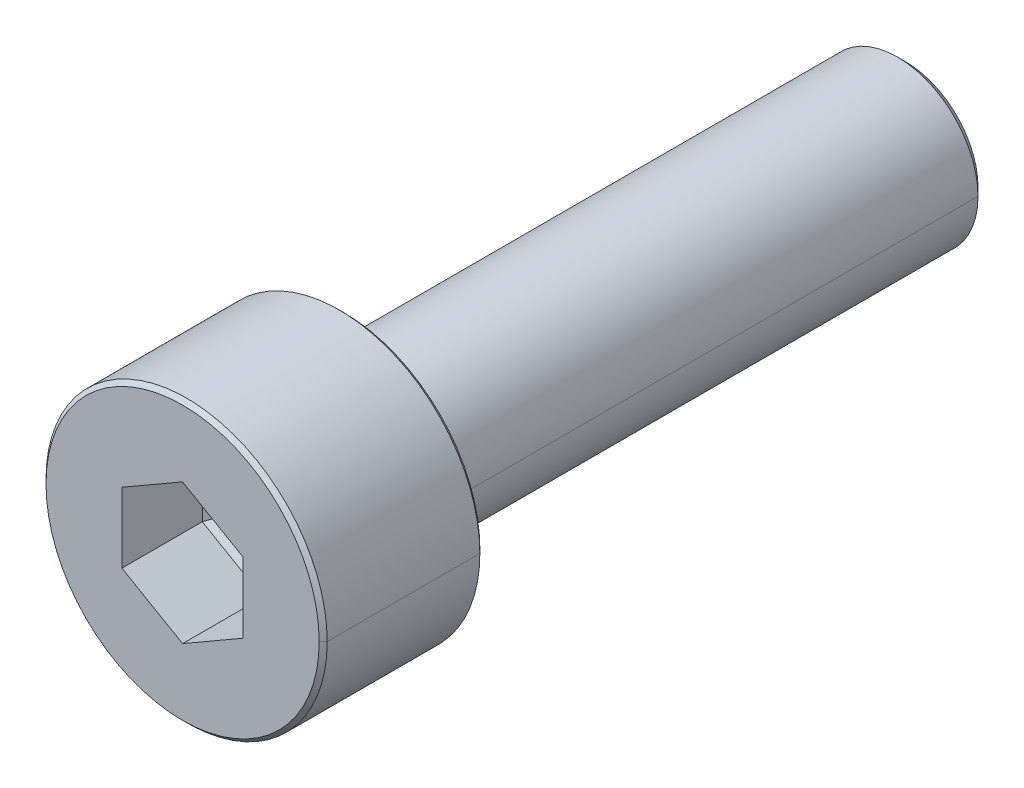
ISO-10303-21;
HEADER;
FILE_DESCRIPTION(('STEP AP214'),'2;1');
FILE_NAME('part.step','',(''),(''),'','','');
FILE_SCHEMA(('AUTOMOTIVE_DESIGN { 1 0 10303 214 1 1 1 1 }'));
ENDSEC;
DATA;
#1=APPLICATION_CONTEXT('core data for automotive mechanical design processes');
#2=APPLICATION_PROTOCOL_DEFINITION('international standard','automotive_design',2000,#1);
#3=PRODUCT_CONTEXT('',#1,'mechanical');
#4=PRODUCT('Part','Part','',(#3));
#5=PRODUCT_RELATED_PRODUCT_CATEGORY('part','',(#4));
#6=PRODUCT_DEFINITION_FORMATION('','',#4);
#7=PRODUCT_DEFINITION_CONTEXT('part definition',#1,'design');
#8=PRODUCT_DEFINITION('design','',#6,#7);
#9=PRODUCT_DEFINITION_SHAPE('','',#8);
#10=(LENGTH_UNIT() NAMED_UNIT(*) SI_UNIT(.MILLI.,.METRE.));
#11=(NAMED_UNIT(*) PLANE_ANGLE_UNIT() SI_UNIT($,.RADIAN.));
#12=(NAMED_UNIT(*) SI_UNIT($,.STERADIAN.) SOLID_ANGLE_UNIT());
#13=UNCERTAINTY_MEASURE_WITH_UNIT(LENGTH_MEASURE(1.E-05),#10,'distance_accuracy_value','');
#14=(GEOMETRIC_REPRESENTATION_CONTEXT(3) GLOBAL_UNCERTAINTY_ASSIGNED_CONTEXT((#13)) GLOBAL_UNIT_ASSIGNED_CONTEXT((#10,
#11,#12)) REPRESENTATION_CONTEXT('',''));
#15=CARTESIAN_POINT('',(0.,0.,0.));
#16=DIRECTION('',(0.,0.,1.));
#17=DIRECTION('',(1.,0.,0.));
#18=AXIS2_PLACEMENT_3D('',#15,#16,#17);
#19=CARTESIAN_POINT('',(0.,0.,14.));
#20=DIRECTION('',(0.,0.,1.));
#21=DIRECTION('',(1.,0.,0.));
#22=AXIS2_PLACEMENT_3D('',#19,#20,#21);
#23=CYLINDRICAL_SURFACE('',#22,3.5);
#24=DIRECTION('',(0.,0.,1.));
#25=VECTOR('',#24,1.);
#26=CARTESIAN_POINT('',(3.500000392578,9.868314090465E-10,14.09999960728));
#27=LINE('',#26,#25);
#28=CARTESIAN_POINT('',(3.5,0.,14.1000010898));
#29=VERTEX_POINT('',#28);
#30=CARTESIAN_POINT('',(3.5,0.,17.8999989102));
#31=VERTEX_POINT('',#30);
#32=EDGE_CURVE('E242',#29,#31,#27,.T.);
#33=ORIENTED_EDGE('',*,*,#32,.F.);
#34=CARTESIAN_POINT('',(0.,0.,14.1000010898));
#35=DIRECTION('',(0.,0.,-1.));
#36=DIRECTION('',(-1.,0.,0.));
#37=AXIS2_PLACEMENT_3D('',#34,#35,#36);
#38=CIRCLE('',#37,3.5);
#39=CARTESIAN_POINT('',(-3.5,0.,14.1000010898));
#40=VERTEX_POINT('',#39);
#41=EDGE_CURVE('E326',#40,#29,#38,.T.);
#42=ORIENTED_EDGE('',*,*,#41,.F.);
#43=DIRECTION('',(0.,0.,1.));
#44=VECTOR('',#43,1.);
#45=CARTESIAN_POINT('',(-3.500000392578,-9.868312386459E-10,14.09999960728));
#46=LINE('',#45,#44);
#47=CARTESIAN_POINT('',(-3.5,0.,17.8999989102));
#48=VERTEX_POINT('',#47);
#49=EDGE_CURVE('E196',#40,#48,#46,.T.);
#50=ORIENTED_EDGE('',*,*,#49,.T.);
#51=CARTESIAN_POINT('',(0.,0.,17.8999989102));
#52=DIRECTION('',(0.,0.,1.));
#53=DIRECTION('',(1.,0.,0.));
#54=AXIS2_PLACEMENT_3D('',#51,#52,#53);
#55=CIRCLE('',#54,3.5);
#56=EDGE_CURVE('E10',#31,#48,#55,.T.);
#57=ORIENTED_EDGE('',*,*,#56,.F.);
#58=EDGE_LOOP('',(#33,#42,#50,#57));
#59=FACE_BOUND('',#58,.T.);
#60=ADVANCED_FACE('F15',(#59),#23,.T.);
#61=CARTESIAN_POINT('',(0.,0.,17.95000064832));
#62=DIRECTION('',(0.,0.,-1.));
#63=DIRECTION('',(0.,-1.,0.));
#64=AXIS2_PLACEMENT_3D('',#61,#62,#63);
#65=CONICAL_SURFACE('',#64,3.450000899835,0.785398387767055);
#66=DIRECTION('',(0.707105961477072,-2.06015458292692E-09,-0.707107600895072));
#67=VECTOR('',#66,1.);
#68=CARTESIAN_POINT('',(3.400000508482,1.278181819394E-09,18.00000050866));
#69=LINE('',#68,#67);
#70=CARTESIAN_POINT('',(3.400000239535,0.,18.00000128618));
#71=VERTEX_POINT('',#70);
#72=EDGE_CURVE('E219',#71,#31,#69,.T.);
#73=ORIENTED_EDGE('',*,*,#72,.T.);
#74=ORIENTED_EDGE('',*,*,#56,.T.);
#75=DIRECTION('',(-0.707105961477072,2.06016104728192E-09,-0.707107600895072));
#76=VECTOR('',#75,1.);
#77=CARTESIAN_POINT('',(-3.400000508482,-1.278182035835E-09,18.00000050866));
#78=LINE('',#77,#76);
#79=CARTESIAN_POINT('',(-3.400000239535,0.,18.00000128618));
#80=VERTEX_POINT('',#79);
#81=EDGE_CURVE('E224',#80,#48,#78,.T.);
#82=ORIENTED_EDGE('',*,*,#81,.F.);
#83=CARTESIAN_POINT('',(0.,0.,18.00000128618));
#84=DIRECTION('',(0.,0.,1.));
#85=DIRECTION('',(1.,0.,0.));
#86=AXIS2_PLACEMENT_3D('',#83,#84,#85);
#87=CIRCLE('',#86,3.400000239535);
#88=EDGE_CURVE('E235',#71,#80,#87,.T.);
#89=ORIENTED_EDGE('',*,*,#88,.F.);
#90=EDGE_LOOP('',(#73,#74,#82,#89));
#91=FACE_BOUND('',#90,.T.);
#92=ADVANCED_FACE('F384',(#91),#65,.T.);
#93=CARTESIAN_POINT('',(0.,0.,15.));
#94=DIRECTION('',(0.,0.,1.));
#95=DIRECTION('',(1.,0.,0.));
#96=AXIS2_PLACEMENT_3D('',#93,#94,#95);
#97=PLANE('',#96);
#98=DIRECTION('',(-0.866025403784429,0.500000000000017,0.));
#99=VECTOR('',#98,1.);
#100=CARTESIAN_POINT('',(0.08660254037844,0.05,15.));
#101=LINE('',#100,#99);
#102=CARTESIAN_POINT('',(0.08660254037844,0.05,15.));
#103=VERTEX_POINT('',#102);
#104=CARTESIAN_POINT('',(0.,0.1,15.));
#105=VERTEX_POINT('',#104);
#106=EDGE_CURVE('E256',#103,#105,#101,.T.);
#107=ORIENTED_EDGE('',*,*,#106,.T.);
#108=DIRECTION('',(-0.866025403784429,-0.500000000000017,0.));
#109=VECTOR('',#108,1.);
#110=CARTESIAN_POINT('',(0.,0.1,15.));
#111=LINE('',#110,#109);
#112=CARTESIAN_POINT('',(-0.08660254037844,0.05,15.));
#113=VERTEX_POINT('',#112);
#114=EDGE_CURVE('E208',#105,#113,#111,.T.);
#115=ORIENTED_EDGE('',*,*,#114,.T.);
#116=DIRECTION('',(0.,-1.,0.));
#117=VECTOR('',#116,1.);
#118=CARTESIAN_POINT('',(-0.08660254037844,0.05,15.));
#119=LINE('',#118,#117);
#120=CARTESIAN_POINT('',(-0.08660254037844,-0.05,15.));
#121=VERTEX_POINT('',#120);
#122=EDGE_CURVE('E40',#113,#121,#119,.T.);
#123=ORIENTED_EDGE('',*,*,#122,.T.);
#124=DIRECTION('',(0.866025403784429,-0.500000000000017,0.));
#125=VECTOR('',#124,1.);
#126=CARTESIAN_POINT('',(-0.08660254037844,-0.05,15.));
#127=LINE('',#126,#125);
#128=CARTESIAN_POINT('',(0.,-0.1,15.));
#129=VERTEX_POINT('',#128);
#130=EDGE_CURVE('E279',#121,#129,#127,.T.);
#131=ORIENTED_EDGE('',*,*,#130,.T.);
#132=DIRECTION('',(0.866025403784429,0.500000000000017,0.));
#133=VECTOR('',#132,1.);
#134=CARTESIAN_POINT('',(0.,-0.1,15.));
#135=LINE('',#134,#133);
#136=CARTESIAN_POINT('',(0.08660254037844,-0.05,15.));
#137=VERTEX_POINT('',#136);
#138=EDGE_CURVE('E310',#129,#137,#135,.T.);
#139=ORIENTED_EDGE('',*,*,#138,.T.);
#140=DIRECTION('',(0.,1.,0.));
#141=VECTOR('',#140,1.);
#142=CARTESIAN_POINT('',(0.08660254037844,-0.05,15.));
#143=LINE('',#142,#141);
#144=EDGE_CURVE('E255',#137,#103,#143,.T.);
#145=ORIENTED_EDGE('',*,*,#144,.T.);
#146=EDGE_LOOP('',(#107,#115,#123,#131,#139,#145));
#147=FACE_BOUND('',#146,.T.);
#148=ADVANCED_FACE('F376',(#147),#97,.T.);
#149=CARTESIAN_POINT('',(-1.51,0.8717989064763,18.));
#150=DIRECTION('',(-1.,0.,0.));
#151=DIRECTION('',(0.,0.,1.));
#152=AXIS2_PLACEMENT_3D('',#149,#150,#151);
#153=PLANE('',#152);
#154=DIRECTION('',(0.,0.,-1.));
#155=VECTOR('',#154,1.);
#156=CARTESIAN_POINT('',(-1.51,0.8717989064763,18.));
#157=LINE('',#156,#155);
#158=CARTESIAN_POINT('',(-1.51,0.8717989064763,18.));
#159=VERTEX_POINT('',#158);
#160=CARTESIAN_POINT('',(-1.51,0.8717989064763,16.));
#161=VERTEX_POINT('',#160);
#162=EDGE_CURVE('E213',#159,#161,#157,.T.);
#163=ORIENTED_EDGE('',*,*,#162,.F.);
#164=DIRECTION('',(0.,-1.,0.));
#165=VECTOR('',#164,1.);
#166=CARTESIAN_POINT('',(-1.51,0.8717989064763,18.));
#167=LINE('',#166,#165);
#168=CARTESIAN_POINT('',(-1.51,-0.8717989064763,18.));
#169=VERTEX_POINT('',#168);
#170=EDGE_CURVE('E175',#159,#169,#167,.T.);
#171=ORIENTED_EDGE('',*,*,#170,.T.);
#172=DIRECTION('',(0.,0.,-1.));
#173=VECTOR('',#172,1.);
#174=CARTESIAN_POINT('',(-1.51,-0.8717989064763,18.));
#175=LINE('',#174,#173);
#176=CARTESIAN_POINT('',(-1.51,-0.8717989064763,16.));
#177=VERTEX_POINT('',#176);
#178=EDGE_CURVE('E165',#169,#177,#175,.T.);
#179=ORIENTED_EDGE('',*,*,#178,.T.);
#180=DIRECTION('',(0.,-1.,0.));
#181=VECTOR('',#180,1.);
#182=CARTESIAN_POINT('',(-1.51,0.8717989064763,16.));
#183=LINE('',#182,#181);
#184=EDGE_CURVE('E26',#161,#177,#183,.T.);
#185=ORIENTED_EDGE('',*,*,#184,.F.);
#186=EDGE_LOOP('',(#163,#171,#179,#185));
#187=FACE_BOUND('',#186,.T.);
#188=ADVANCED_FACE('F374',(#187),#153,.F.);
#189=CARTESIAN_POINT('',(-0.7983012701892,0.,15.5));
#190=DIRECTION('',(-0.574858833163703,0.,-0.818252602766204));
#191=DIRECTION('',(-0.818252602766204,0.,0.574858833163703));
#192=AXIS2_PLACEMENT_3D('',#189,#190,#191);
#193=PLANE('',#192);
#194=DIRECTION('',(-0.73984776843439,-0.427151308264895,0.519775951146493));
#195=VECTOR('',#194,1.);
#196=CARTESIAN_POINT('',(-0.08660254037844,-0.05,15.));
#197=LINE('',#196,#195);
#198=EDGE_CURVE('E316',#121,#177,#197,.T.);
#199=ORIENTED_EDGE('',*,*,#198,.F.);
#200=ORIENTED_EDGE('',*,*,#122,.F.);
#201=DIRECTION('',(-0.73984776843439,0.427151308264895,0.519775951146493));
#202=VECTOR('',#201,1.);
#203=CARTESIAN_POINT('',(-0.08660254037844,0.05,15.));
#204=LINE('',#203,#202);
#205=EDGE_CURVE('E204',#113,#161,#204,.T.);
#206=ORIENTED_EDGE('',*,*,#205,.T.);
#207=ORIENTED_EDGE('',*,*,#184,.T.);
#208=EDGE_LOOP('',(#199,#200,#206,#207));
#209=FACE_BOUND('',#208,.T.);
#210=ADVANCED_FACE('F367',(#209),#193,.F.);
#211=CARTESIAN_POINT('',(-0.3991506350946,-0.6913491798573,15.5));
#212=DIRECTION('',(-0.287429416581812,-0.49784235310962,-0.818252602766234));
#213=DIRECTION('',(0.,-0.854302616529847,0.519775951146508));
#214=AXIS2_PLACEMENT_3D('',#211,#212,#213);
#215=PLANE('',#214);
#216=DIRECTION('',(0.,-0.854302616529838,0.519775951146523));
#217=VECTOR('',#216,1.);
#218=CARTESIAN_POINT('',(0.,-0.1,15.));
#219=LINE('',#218,#217);
#220=CARTESIAN_POINT('',(0.,-1.743597812953,16.));
#221=VERTEX_POINT('',#220);
#222=EDGE_CURVE('E251',#129,#221,#219,.T.);
#223=ORIENTED_EDGE('',*,*,#222,.F.);
#224=ORIENTED_EDGE('',*,*,#130,.F.);
#225=ORIENTED_EDGE('',*,*,#198,.T.);
#226=DIRECTION('',(0.866025403784429,-0.500000000000017,0.));
#227=VECTOR('',#226,1.);
#228=CARTESIAN_POINT('',(-1.51,-0.8717989064763,16.));
#229=LINE('',#228,#227);
#230=EDGE_CURVE('E277',#177,#221,#229,.T.);
#231=ORIENTED_EDGE('',*,*,#230,.T.);
#232=EDGE_LOOP('',(#223,#224,#225,#231));
#233=FACE_BOUND('',#232,.T.);
#234=ADVANCED_FACE('F373',(#233),#215,.F.);
#235=CARTESIAN_POINT('',(-1.51,-0.8717989064763,18.));
#236=DIRECTION('',(-0.500000000000017,-0.866025403784429,0.));
#237=DIRECTION('',(-0.866025403784429,0.500000000000017,0.));
#238=AXIS2_PLACEMENT_3D('',#235,#236,#237);
#239=PLANE('',#238);
#240=ORIENTED_EDGE('',*,*,#178,.F.);
#241=DIRECTION('',(0.866025403784429,-0.500000000000017,0.));
#242=VECTOR('',#241,1.);
#243=CARTESIAN_POINT('',(-1.51,-0.8717989064763,18.));
#244=LINE('',#243,#242);
#245=CARTESIAN_POINT('',(0.,-1.743597812953,18.));
#246=VERTEX_POINT('',#245);
#247=EDGE_CURVE('E168',#169,#246,#244,.T.);
#248=ORIENTED_EDGE('',*,*,#247,.T.);
#249=DIRECTION('',(0.,0.,-1.));
#250=VECTOR('',#249,1.);
#251=CARTESIAN_POINT('',(0.,-1.743597812953,18.));
#252=LINE('',#251,#250);
#253=EDGE_CURVE('E153',#246,#221,#252,.T.);
#254=ORIENTED_EDGE('',*,*,#253,.T.);
#255=ORIENTED_EDGE('',*,*,#230,.F.);
#256=EDGE_LOOP('',(#240,#248,#254,#255));
#257=FACE_BOUND('',#256,.T.);
#258=ADVANCED_FACE('F169',(#257),#239,.F.);
#259=CARTESIAN_POINT('',(0.,-1.743597812953,18.));
#260=DIRECTION('',(0.500000000000017,-0.866025403784429,0.));
#261=DIRECTION('',(0.,0.,-1.));
#262=AXIS2_PLACEMENT_3D('',#259,#260,#261);
#263=PLANE('',#262);
#264=ORIENTED_EDGE('',*,*,#253,.F.);
#265=DIRECTION('',(0.866025403784429,0.500000000000017,0.));
#266=VECTOR('',#265,1.);
#267=CARTESIAN_POINT('',(0.,-1.743597812953,18.));
#268=LINE('',#267,#266);
#269=CARTESIAN_POINT('',(1.51,-0.8717989064763,18.));
#270=VERTEX_POINT('',#269);
#271=EDGE_CURVE('E158',#246,#270,#268,.T.);
#272=ORIENTED_EDGE('',*,*,#271,.T.);
#273=DIRECTION('',(0.,0.,-1.));
#274=VECTOR('',#273,1.);
#275=CARTESIAN_POINT('',(1.51,-0.8717989064763,18.));
#276=LINE('',#275,#274);
#277=CARTESIAN_POINT('',(1.51,-0.8717989064763,16.));
#278=VERTEX_POINT('',#277);
#279=EDGE_CURVE('E247',#270,#278,#276,.T.);
#280=ORIENTED_EDGE('',*,*,#279,.T.);
#281=DIRECTION('',(0.866025403784429,0.500000000000017,0.));
#282=VECTOR('',#281,1.);
#283=CARTESIAN_POINT('',(0.,-1.743597812953,16.));
#284=LINE('',#283,#282);
#285=EDGE_CURVE('E160',#221,#278,#284,.T.);
#286=ORIENTED_EDGE('',*,*,#285,.F.);
#287=EDGE_LOOP('',(#264,#272,#280,#286));
#288=FACE_BOUND('',#287,.T.);
#289=ADVANCED_FACE('F155',(#288),#263,.F.);
#290=CARTESIAN_POINT('',(0.3991506350946,-0.6913491798573,15.5));
#291=DIRECTION('',(0.287429416581812,-0.49784235310962,-0.818252602766234));
#292=DIRECTION('',(0.,-0.854302616529847,0.519775951146508));
#293=AXIS2_PLACEMENT_3D('',#290,#291,#292);
#294=PLANE('',#293);
#295=DIRECTION('',(0.73984776843439,-0.427151308264895,0.519775951146493));
#296=VECTOR('',#295,1.);
#297=CARTESIAN_POINT('',(0.08660254037844,-0.05,15.));
#298=LINE('',#297,#296);
#299=EDGE_CURVE('E313',#137,#278,#298,.T.);
#300=ORIENTED_EDGE('',*,*,#299,.F.);
#301=ORIENTED_EDGE('',*,*,#138,.F.);
#302=ORIENTED_EDGE('',*,*,#222,.T.);
#303=ORIENTED_EDGE('',*,*,#285,.T.);
#304=EDGE_LOOP('',(#300,#301,#302,#303));
#305=FACE_BOUND('',#304,.T.);
#306=ADVANCED_FACE('F446',(#305),#294,.F.);
#307=CARTESIAN_POINT('',(0.7983012701892,0.,15.5));
#308=DIRECTION('',(0.574858833163703,0.,-0.818252602766204));
#309=DIRECTION('',(0.,-1.,0.));
#310=AXIS2_PLACEMENT_3D('',#307,#308,#309);
#311=PLANE('',#310);
#312=DIRECTION('',(0.73984776843439,0.427151308264895,0.519775951146493));
#313=VECTOR('',#312,1.);
#314=CARTESIAN_POINT('',(0.08660254037844,0.05,15.));
#315=LINE('',#314,#313);
#316=CARTESIAN_POINT('',(1.51,0.8717989064763,16.));
#317=VERTEX_POINT('',#316);
#318=EDGE_CURVE('E259',#103,#317,#315,.T.);
#319=ORIENTED_EDGE('',*,*,#318,.F.);
#320=ORIENTED_EDGE('',*,*,#144,.F.);
#321=ORIENTED_EDGE('',*,*,#299,.T.);
#322=DIRECTION('',(0.,1.,0.));
#323=VECTOR('',#322,1.);
#324=CARTESIAN_POINT('',(1.51,-0.8717989064763,16.));
#325=LINE('',#324,#323);
#326=EDGE_CURVE('E252',#278,#317,#325,.T.);
#327=ORIENTED_EDGE('',*,*,#326,.T.);
#328=EDGE_LOOP('',(#319,#320,#321,#327));
#329=FACE_BOUND('',#328,.T.);
#330=ADVANCED_FACE('F442',(#329),#311,.F.);
#331=CARTESIAN_POINT('',(1.51,-0.8717989064763,18.));
#332=DIRECTION('',(1.,0.,0.));
#333=DIRECTION('',(0.,1.,0.));
#334=AXIS2_PLACEMENT_3D('',#331,#332,#333);
#335=PLANE('',#334);
#336=ORIENTED_EDGE('',*,*,#279,.F.);
#337=DIRECTION('',(0.,1.,0.));
#338=VECTOR('',#337,1.);
#339=CARTESIAN_POINT('',(1.51,-0.8717989064763,18.));
#340=LINE('',#339,#338);
#341=CARTESIAN_POINT('',(1.51,0.8717989064763,18.));
#342=VERTEX_POINT('',#341);
#343=EDGE_CURVE('E181',#270,#342,#340,.T.);
#344=ORIENTED_EDGE('',*,*,#343,.T.);
#345=DIRECTION('',(0.,0.,-1.));
#346=VECTOR('',#345,1.);
#347=CARTESIAN_POINT('',(1.51,0.8717989064763,18.));
#348=LINE('',#347,#346);
#349=EDGE_CURVE('E243',#342,#317,#348,.T.);
#350=ORIENTED_EDGE('',*,*,#349,.T.);
#351=ORIENTED_EDGE('',*,*,#326,.F.);
#352=EDGE_LOOP('',(#336,#344,#350,#351));
#353=FACE_BOUND('',#352,.T.);
#354=ADVANCED_FACE('F445',(#353),#335,.F.);
#355=CARTESIAN_POINT('',(1.51,0.8717989064763,18.));
#356=DIRECTION('',(0.500000000000017,0.866025403784429,0.));
#357=DIRECTION('',(0.,0.,-1.));
#358=AXIS2_PLACEMENT_3D('',#355,#356,#357);
#359=PLANE('',#358);
#360=ORIENTED_EDGE('',*,*,#349,.F.);
#361=DIRECTION('',(-0.866025403784429,0.500000000000017,0.));
#362=VECTOR('',#361,1.);
#363=CARTESIAN_POINT('',(1.51,0.8717989064763,18.));
#364=LINE('',#363,#362);
#365=CARTESIAN_POINT('',(0.,1.743597812953,18.));
#366=VERTEX_POINT('',#365);
#367=EDGE_CURVE('E188',#342,#366,#364,.T.);
#368=ORIENTED_EDGE('',*,*,#367,.T.);
#369=DIRECTION('',(0.,0.,-1.));
#370=VECTOR('',#369,1.);
#371=CARTESIAN_POINT('',(0.,1.743597812953,18.));
#372=LINE('',#371,#370);
#373=CARTESIAN_POINT('',(0.,1.743597812953,16.));
#374=VERTEX_POINT('',#373);
#375=EDGE_CURVE('E203',#366,#374,#372,.T.);
#376=ORIENTED_EDGE('',*,*,#375,.T.);
#377=DIRECTION('',(-0.866025403784429,0.500000000000017,0.));
#378=VECTOR('',#377,1.);
#379=CARTESIAN_POINT('',(1.51,0.8717989064763,16.));
#380=LINE('',#379,#378);
#381=EDGE_CURVE('E248',#317,#374,#380,.T.);
#382=ORIENTED_EDGE('',*,*,#381,.F.);
#383=EDGE_LOOP('',(#360,#368,#376,#382));
#384=FACE_BOUND('',#383,.T.);
#385=ADVANCED_FACE('F286',(#384),#359,.F.);
#386=CARTESIAN_POINT('',(0.3991506350946,0.6913491798573,15.5));
#387=DIRECTION('',(0.287429416581812,0.49784235310962,-0.818252602766234));
#388=DIRECTION('',(-0.943483483502328,0.,-0.331419547338885));
#389=AXIS2_PLACEMENT_3D('',#386,#387,#388);
#390=PLANE('',#389);
#391=DIRECTION('',(0.,0.854302616529838,0.519775951146523));
#392=VECTOR('',#391,1.);
#393=CARTESIAN_POINT('',(0.,0.1,15.));
#394=LINE('',#393,#392);
#395=EDGE_CURVE('E260',#105,#374,#394,.T.);
#396=ORIENTED_EDGE('',*,*,#395,.F.);
#397=ORIENTED_EDGE('',*,*,#106,.F.);
#398=ORIENTED_EDGE('',*,*,#318,.T.);
#399=ORIENTED_EDGE('',*,*,#381,.T.);
#400=EDGE_LOOP('',(#396,#397,#398,#399));
#401=FACE_BOUND('',#400,.T.);
#402=ADVANCED_FACE('F451',(#401),#390,.F.);
#403=CARTESIAN_POINT('',(-0.3991506350946,0.6913491798573,15.5));
#404=DIRECTION('',(-0.287429416581812,0.49784235310962,-0.818252602766234));
#405=DIRECTION('',(-0.943483483502328,0.,0.331419547338885));
#406=AXIS2_PLACEMENT_3D('',#403,#404,#405);
#407=PLANE('',#406);
#408=ORIENTED_EDGE('',*,*,#205,.F.);
#409=ORIENTED_EDGE('',*,*,#114,.F.);
#410=ORIENTED_EDGE('',*,*,#395,.T.);
#411=DIRECTION('',(-0.866025403784429,-0.500000000000017,0.));
#412=VECTOR('',#411,1.);
#413=CARTESIAN_POINT('',(0.,1.743597812953,16.));
#414=LINE('',#413,#412);
#415=EDGE_CURVE('E209',#374,#161,#414,.T.);
#416=ORIENTED_EDGE('',*,*,#415,.T.);
#417=EDGE_LOOP('',(#408,#409,#410,#416));
#418=FACE_BOUND('',#417,.T.);
#419=ADVANCED_FACE('F448',(#418),#407,.F.);
#420=CARTESIAN_POINT('',(0.,1.743597812953,18.));
#421=DIRECTION('',(-0.500000000000017,0.866025403784429,0.));
#422=DIRECTION('',(0.,0.,1.));
#423=AXIS2_PLACEMENT_3D('',#420,#421,#422);
#424=PLANE('',#423);
#425=ORIENTED_EDGE('',*,*,#375,.F.);
#426=DIRECTION('',(-0.866025403784429,-0.500000000000017,0.));
#427=VECTOR('',#426,1.);
#428=CARTESIAN_POINT('',(0.,1.743597812953,18.));
#429=LINE('',#428,#427);
#430=EDGE_CURVE('E199',#366,#159,#429,.T.);
#431=ORIENTED_EDGE('',*,*,#430,.T.);
#432=ORIENTED_EDGE('',*,*,#162,.T.);
#433=ORIENTED_EDGE('',*,*,#415,.F.);
#434=EDGE_LOOP('',(#425,#431,#432,#433));
#435=FACE_BOUND('',#434,.T.);
#436=ADVANCED_FACE('F290',(#435),#424,.F.);
#437=CARTESIAN_POINT('',(0.,0.,18.));
#438=DIRECTION('',(0.,0.,1.));
#439=DIRECTION('',(1.,0.,0.));
#440=AXIS2_PLACEMENT_3D('',#437,#438,#439);
#441=PLANE('',#440);
#442=ORIENTED_EDGE('',*,*,#367,.F.);
#443=ORIENTED_EDGE('',*,*,#343,.F.);
#444=ORIENTED_EDGE('',*,*,#271,.F.);
#445=ORIENTED_EDGE('',*,*,#247,.F.);
#446=ORIENTED_EDGE('',*,*,#170,.F.);
#447=ORIENTED_EDGE('',*,*,#430,.F.);
#448=EDGE_LOOP('',(#442,#443,#444,#445,#446,#447));
#449=FACE_BOUND('',#448,.T.);
#450=CARTESIAN_POINT('',(0.,0.,18.00000128618));
#451=DIRECTION('',(0.,0.,1.));
#452=DIRECTION('',(-1.,0.,0.));
#453=AXIS2_PLACEMENT_3D('',#450,#451,#452);
#454=CIRCLE('',#453,3.400000239535);
#455=EDGE_CURVE('E223',#80,#71,#454,.T.);
#456=ORIENTED_EDGE('',*,*,#455,.T.);
#457=ORIENTED_EDGE('',*,*,#88,.T.);
#458=EDGE_LOOP('',(#456,#457));
#459=FACE_BOUND('',#458,.T.);
#460=ADVANCED_FACE('F178',(#449,#459),#441,.T.);
#461=CARTESIAN_POINT('',(0.,0.,17.95000064832));
#462=DIRECTION('',(0.,0.,-1.));
#463=DIRECTION('',(0.,-1.,0.));
#464=AXIS2_PLACEMENT_3D('',#461,#462,#463);
#465=CONICAL_SURFACE('',#464,3.450000899835,0.785398387767055);
#466=ORIENTED_EDGE('',*,*,#81,.T.);
#467=CARTESIAN_POINT('',(0.,0.,17.8999989102));
#468=DIRECTION('',(0.,0.,1.));
#469=DIRECTION('',(-1.,0.,0.));
#470=AXIS2_PLACEMENT_3D('',#467,#468,#469);
#471=CIRCLE('',#470,3.5);
#472=EDGE_CURVE('E238',#48,#31,#471,.T.);
#473=ORIENTED_EDGE('',*,*,#472,.T.);
#474=ORIENTED_EDGE('',*,*,#72,.F.);
#475=ORIENTED_EDGE('',*,*,#455,.F.);
#476=EDGE_LOOP('',(#466,#473,#474,#475));
#477=FACE_BOUND('',#476,.T.);
#478=ADVANCED_FACE('F401',(#477),#465,.T.);
#479=CARTESIAN_POINT('',(0.,0.,14.));
#480=DIRECTION('',(0.,0.,1.));
#481=DIRECTION('',(1.,0.,0.));
#482=AXIS2_PLACEMENT_3D('',#479,#480,#481);
#483=CYLINDRICAL_SURFACE('',#482,3.5);
#484=ORIENTED_EDGE('',*,*,#49,.F.);
#485=CARTESIAN_POINT('',(0.,0.,14.1000010898));
#486=DIRECTION('',(0.,0.,-1.));
#487=DIRECTION('',(1.,0.,0.));
#488=AXIS2_PLACEMENT_3D('',#485,#486,#487);
#489=CIRCLE('',#488,3.5);
#490=EDGE_CURVE('E194',#29,#40,#489,.T.);
#491=ORIENTED_EDGE('',*,*,#490,.F.);
#492=ORIENTED_EDGE('',*,*,#32,.T.);
#493=ORIENTED_EDGE('',*,*,#472,.F.);
#494=EDGE_LOOP('',(#484,#491,#492,#493));
#495=FACE_BOUND('',#494,.T.);
#496=ADVANCED_FACE('F403',(#495),#483,.T.);
#497=CARTESIAN_POINT('',(0.,0.,14.04999935168));
#498=DIRECTION('',(0.,0.,1.));
#499=DIRECTION('',(0.,-1.,0.));
#500=AXIS2_PLACEMENT_3D('',#497,#498,#499);
#501=CONICAL_SURFACE('',#500,3.450000899835,0.785398387767055);
#502=DIRECTION('',(0.707105961477072,-2.06016117731292E-09,0.707107600895072));
#503=VECTOR('',#502,1.);
#504=CARTESIAN_POINT('',(3.400000508482,1.278182196869E-09,13.99999949134));
#505=LINE('',#504,#503);
#506=CARTESIAN_POINT('',(3.400000239535,0.,13.99999871382));
#507=VERTEX_POINT('',#506);
#508=EDGE_CURVE('E197',#507,#29,#505,.T.);
#509=ORIENTED_EDGE('',*,*,#508,.T.);
#510=ORIENTED_EDGE('',*,*,#490,.T.);
#511=DIRECTION('',(-0.707105961477072,2.06015857463092E-09,0.707107600895072));
#512=VECTOR('',#511,1.);
#513=CARTESIAN_POINT('',(-3.400000508482,-1.278181658394E-09,13.99999949134));
#514=LINE('',#513,#512);
#515=CARTESIAN_POINT('',(-3.400000239535,0.,13.99999871382));
#516=VERTEX_POINT('',#515);
#517=EDGE_CURVE('E302',#516,#40,#514,.T.);
#518=ORIENTED_EDGE('',*,*,#517,.F.);
#519=CARTESIAN_POINT('',(0.,0.,13.99999871382));
#520=DIRECTION('',(0.,0.,-1.));
#521=DIRECTION('',(1.,0.,0.));
#522=AXIS2_PLACEMENT_3D('',#519,#520,#521);
#523=CIRCLE('',#522,3.400000239535);
#524=EDGE_CURVE('E303',#507,#516,#523,.T.);
#525=ORIENTED_EDGE('',*,*,#524,.F.);
#526=EDGE_LOOP('',(#509,#510,#518,#525));
#527=FACE_BOUND('',#526,.T.);
#528=ADVANCED_FACE('F397',(#527),#501,.T.);
#529=CARTESIAN_POINT('',(0.,0.,14.04999935168));
#530=DIRECTION('',(0.,0.,1.));
#531=DIRECTION('',(0.,-1.,0.));
#532=AXIS2_PLACEMENT_3D('',#529,#530,#531);
#533=CONICAL_SURFACE('',#532,3.450000899835,0.785398387767055);
#534=ORIENTED_EDGE('',*,*,#517,.T.);
#535=ORIENTED_EDGE('',*,*,#41,.T.);
#536=ORIENTED_EDGE('',*,*,#508,.F.);
#537=CARTESIAN_POINT('',(0.,0.,13.99999871382));
#538=DIRECTION('',(0.,0.,-1.));
#539=DIRECTION('',(-1.,0.,0.));
#540=AXIS2_PLACEMENT_3D('',#537,#538,#539);
#541=CIRCLE('',#540,3.400000239535);
#542=EDGE_CURVE('E299',#516,#507,#541,.T.);
#543=ORIENTED_EDGE('',*,*,#542,.F.);
#544=EDGE_LOOP('',(#534,#535,#536,#543));
#545=FACE_BOUND('',#544,.T.);
#546=ADVANCED_FACE('F422',(#545),#533,.T.);
#547=CARTESIAN_POINT('',(0.,0.,14.));
#548=DIRECTION('',(0.,0.,1.));
#549=DIRECTION('',(1.,0.,0.));
#550=AXIS2_PLACEMENT_3D('',#547,#548,#549);
#551=PLANE('',#550);
#552=CARTESIAN_POINT('',(0.,0.,14.));
#553=DIRECTION('',(0.,0.,1.));
#554=DIRECTION('',(-1.,0.,0.));
#555=AXIS2_PLACEMENT_3D('',#552,#553,#554);
#556=CIRCLE('',#555,2.);
#557=CARTESIAN_POINT('',(-2.,0.,14.));
#558=VERTEX_POINT('',#557);
#559=CARTESIAN_POINT('',(2.,0.,14.));
#560=VERTEX_POINT('',#559);
#561=EDGE_CURVE('E225',#558,#560,#556,.T.);
#562=ORIENTED_EDGE('',*,*,#561,.T.);
#563=CARTESIAN_POINT('',(0.,0.,14.));
#564=DIRECTION('',(0.,0.,1.));
#565=DIRECTION('',(1.,0.,0.));
#566=AXIS2_PLACEMENT_3D('',#563,#564,#565);
#567=CIRCLE('',#566,2.);
#568=EDGE_CURVE('E309',#560,#558,#567,.T.);
#569=ORIENTED_EDGE('',*,*,#568,.T.);
#570=EDGE_LOOP('',(#562,#569));
#571=FACE_BOUND('',#570,.T.);
#572=ORIENTED_EDGE('',*,*,#524,.T.);
#573=ORIENTED_EDGE('',*,*,#542,.T.);
#574=EDGE_LOOP('',(#572,#573));
#575=FACE_BOUND('',#574,.T.);
#576=ADVANCED_FACE('F428',(#571,#575),#551,.F.);
#577=CARTESIAN_POINT('',(0.,0.,0.));
#578=DIRECTION('',(0.,0.,1.));
#579=DIRECTION('',(1.,0.,0.));
#580=AXIS2_PLACEMENT_3D('',#577,#578,#579);
#581=CYLINDRICAL_SURFACE('',#580,2.);
#582=DIRECTION('',(-2.68322055587891E-07,4.66827310603683E-11,0.999999999999964));
#583=VECTOR('',#582,1.);
#584=CARTESIAN_POINT('',(-1.999996297157,-6.442212708693E-10,0.2000037023218));
#585=LINE('',#584,#583);
#586=CARTESIAN_POINT('',(-2.,0.,0.2000017558099));
#587=VERTEX_POINT('',#586);
#588=EDGE_CURVE('E229',#587,#558,#585,.T.);
#589=ORIENTED_EDGE('',*,*,#588,.T.);
#590=ORIENTED_EDGE('',*,*,#568,.F.);
#591=DIRECTION('',(2.6832205562009E-07,-4.66827427134083E-11,0.999999999999964));
#592=VECTOR('',#591,1.);
#593=CARTESIAN_POINT('',(1.999996297157,6.442214316811E-10,0.2000037023218));
#594=LINE('',#593,#592);
#595=CARTESIAN_POINT('',(2.,0.,0.2000017558099));
#596=VERTEX_POINT('',#595);
#597=EDGE_CURVE('E230',#596,#560,#594,.T.);
#598=ORIENTED_EDGE('',*,*,#597,.F.);
#599=CARTESIAN_POINT('',(0.,0.,0.2000017558099));
#600=DIRECTION('',(0.,0.,-1.));
#601=DIRECTION('',(-1.,0.,0.));
#602=AXIS2_PLACEMENT_3D('',#599,#600,#601);
#603=CIRCLE('',#602,2.);
#604=EDGE_CURVE('E19',#587,#596,#603,.T.);
#605=ORIENTED_EDGE('',*,*,#604,.F.);
#606=EDGE_LOOP('',(#589,#590,#598,#605));
#607=FACE_BOUND('',#606,.T.);
#608=ADVANCED_FACE('F430',(#607),#581,.T.);
#609=CARTESIAN_POINT('',(0.,0.,0.));
#610=DIRECTION('',(0.,0.,1.));
#611=DIRECTION('',(1.,0.,0.));
#612=AXIS2_PLACEMENT_3D('',#609,#610,#611);
#613=CYLINDRICAL_SURFACE('',#612,2.);
#614=ORIENTED_EDGE('',*,*,#597,.T.);
#615=ORIENTED_EDGE('',*,*,#561,.F.);
#616=ORIENTED_EDGE('',*,*,#588,.F.);
#617=CARTESIAN_POINT('',(0.,0.,0.2000017558099));
#618=DIRECTION('',(0.,0.,-1.));
#619=DIRECTION('',(1.,0.,0.));
#620=AXIS2_PLACEMENT_3D('',#617,#618,#619);
#621=CIRCLE('',#620,2.);
#622=EDGE_CURVE('E271',#596,#587,#621,.T.);
#623=ORIENTED_EDGE('',*,*,#622,.F.);
#624=EDGE_LOOP('',(#614,#615,#616,#623));
#625=FACE_BOUND('',#624,.T.);
#626=ADVANCED_FACE('F17',(#625),#613,.T.);
#627=CARTESIAN_POINT('',(0.,0.,0.1000074985509));
#628=DIRECTION('',(0.,0.,1.));
#629=DIRECTION('',(0.,-1.,0.));
#630=AXIS2_PLACEMENT_3D('',#627,#628,#629);
#631=CONICAL_SURFACE('',#630,1.899993428734,0.785394460814635);
#632=DIRECTION('',(0.707109399303001,-4.555341483345E-10,0.707104163060401));
#633=VECTOR('',#632,1.);
#634=CARTESIAN_POINT('',(1.799995556588,7.730659458553E-10,4.44278619612E-06));
#635=LINE('',#634,#633);
#636=CARTESIAN_POINT('',(1.799992556807,0.,5.8860988843E-06));
#637=VERTEX_POINT('',#636);
#638=EDGE_CURVE('E192',#637,#596,#635,.T.);
#639=ORIENTED_EDGE('',*,*,#638,.T.);
#640=ORIENTED_EDGE('',*,*,#622,.T.);
#641=DIRECTION('',(-0.707109399303001,4.55533462713E-10,0.707104163060401));
#642=VECTOR('',#641,1.);
#643=CARTESIAN_POINT('',(-1.799995556588,-7.730655911205E-10,4.442786195676E-06));
#644=LINE('',#643,#642);
#645=CARTESIAN_POINT('',(-1.799992556807,0.,5.8860988843E-06));
#646=VERTEX_POINT('',#645);
#647=EDGE_CURVE('E231',#646,#587,#644,.T.);
#648=ORIENTED_EDGE('',*,*,#647,.F.);
#649=CARTESIAN_POINT('',(0.,0.,5.886098884522E-06));
#650=DIRECTION('',(0.,0.,-1.));
#651=DIRECTION('',(1.,0.,0.));
#652=AXIS2_PLACEMENT_3D('',#649,#650,#651);
#653=CIRCLE('',#652,1.799992556807);
#654=EDGE_CURVE('E214',#637,#646,#653,.T.);
#655=ORIENTED_EDGE('',*,*,#654,.F.);
#656=EDGE_LOOP('',(#639,#640,#648,#655));
#657=FACE_BOUND('',#656,.T.);
#658=ADVANCED_FACE('F457',(#657),#631,.T.);
#659=CARTESIAN_POINT('',(0.,0.,0.1000074985509));
#660=DIRECTION('',(0.,0.,1.));
#661=DIRECTION('',(0.,-1.,0.));
#662=AXIS2_PLACEMENT_3D('',#659,#660,#661);
#663=CONICAL_SURFACE('',#662,1.899993428734,0.785394460814635);
#664=ORIENTED_EDGE('',*,*,#647,.T.);
#665=ORIENTED_EDGE('',*,*,#604,.T.);
#666=ORIENTED_EDGE('',*,*,#638,.F.);
#667=CARTESIAN_POINT('',(0.,0.,5.8860988843E-06));
#668=DIRECTION('',(0.,0.,-1.));
#669=DIRECTION('',(-1.,0.,0.));
#670=AXIS2_PLACEMENT_3D('',#667,#668,#669);
#671=CIRCLE('',#670,1.799992556807);
#672=EDGE_CURVE('E218',#646,#637,#671,.T.);
#673=ORIENTED_EDGE('',*,*,#672,.F.);
#674=EDGE_LOOP('',(#664,#665,#666,#673));
#675=FACE_BOUND('',#674,.T.);
#676=ADVANCED_FACE('F453',(#675),#663,.T.);
#677=CARTESIAN_POINT('',(0.,0.,0.));
#678=DIRECTION('',(0.,0.,1.));
#679=DIRECTION('',(1.,0.,0.));
#680=AXIS2_PLACEMENT_3D('',#677,#678,#679);
#681=PLANE('',#680);
#682=ORIENTED_EDGE('',*,*,#654,.T.);
#683=ORIENTED_EDGE('',*,*,#672,.T.);
#684=EDGE_LOOP('',(#682,#683));
#685=FACE_BOUND('',#684,.T.);
#686=ADVANCED_FACE('F456',(#685),#681,.F.);
#687=CLOSED_SHELL('',(#60,#92,#148,#188,#210,#234,#258,#289,#306,#330,#354,#385,#402,#419,#436,
#460,#478,#496,#528,#546,#576,#608,#626,#658,#676,#686));
#688=MANIFOLD_SOLID_BREP('B1',#687);
#689=ADVANCED_BREP_SHAPE_REPRESENTATION('',(#18,#688),#14);
#690=SHAPE_DEFINITION_REPRESENTATION(#9,#689);
ENDSEC;
END-ISO-10303-21;
